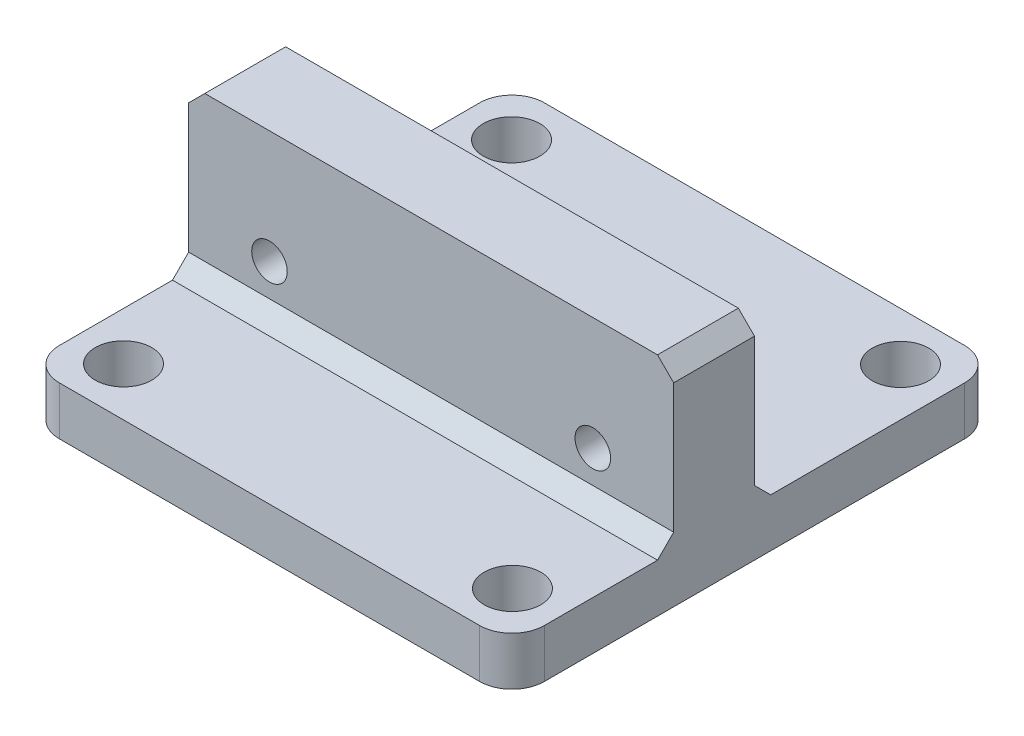
ISO-10303-21;
HEADER;
FILE_DESCRIPTION(('STEP AP214'),'2;1');
FILE_NAME('part.step','',(''),(''),'','','');
FILE_SCHEMA(('AUTOMOTIVE_DESIGN { 1 0 10303 214 1 1 1 1 }'));
ENDSEC;
DATA;
#1=APPLICATION_CONTEXT('core data for automotive mechanical design processes');
#2=APPLICATION_PROTOCOL_DEFINITION('international standard','automotive_design',2000,#1);
#3=PRODUCT_CONTEXT('',#1,'mechanical');
#4=PRODUCT('Part','Part','',(#3));
#5=PRODUCT_RELATED_PRODUCT_CATEGORY('part','',(#4));
#6=PRODUCT_DEFINITION_FORMATION('','',#4);
#7=PRODUCT_DEFINITION_CONTEXT('part definition',#1,'design');
#8=PRODUCT_DEFINITION('design','',#6,#7);
#9=PRODUCT_DEFINITION_SHAPE('','',#8);
#10=(LENGTH_UNIT() NAMED_UNIT(*) SI_UNIT(.MILLI.,.METRE.));
#11=(NAMED_UNIT(*) PLANE_ANGLE_UNIT() SI_UNIT($,.RADIAN.));
#12=(NAMED_UNIT(*) SI_UNIT($,.STERADIAN.) SOLID_ANGLE_UNIT());
#13=UNCERTAINTY_MEASURE_WITH_UNIT(LENGTH_MEASURE(1.E-05),#10,'distance_accuracy_value','');
#14=(GEOMETRIC_REPRESENTATION_CONTEXT(3) GLOBAL_UNCERTAINTY_ASSIGNED_CONTEXT((#13)) GLOBAL_UNIT_ASSIGNED_CONTEXT((#10,
#11,#12)) REPRESENTATION_CONTEXT('',''));
#15=CARTESIAN_POINT('',(0.,0.,0.));
#16=DIRECTION('',(0.,0.,1.));
#17=DIRECTION('',(1.,0.,0.));
#18=AXIS2_PLACEMENT_3D('',#15,#16,#17);
#19=CARTESIAN_POINT('',(15.,0.,-15.));
#20=DIRECTION('',(0.,0.,1.));
#21=DIRECTION('',(0.,-1.,0.));
#22=AXIS2_PLACEMENT_3D('',#19,#20,#21);
#23=PLANE('',#22);
#24=DIRECTION('',(-1.,0.,0.));
#25=VECTOR('',#24,1.);
#26=CARTESIAN_POINT('',(15.,0.,-15.));
#27=LINE('',#26,#25);
#28=CARTESIAN_POINT('',(13.,0.,-15.));
#29=VERTEX_POINT('',#28);
#30=CARTESIAN_POINT('',(-13.,0.,-15.));
#31=VERTEX_POINT('',#30);
#32=EDGE_CURVE('E177',#29,#31,#27,.T.);
#33=ORIENTED_EDGE('',*,*,#32,.T.);
#34=DIRECTION('',(0.,1.,0.));
#35=VECTOR('',#34,1.);
#36=CARTESIAN_POINT('',(-13.,0.,-15.));
#37=LINE('',#36,#35);
#38=CARTESIAN_POINT('',(-13.,3.,-15.));
#39=VERTEX_POINT('',#38);
#40=EDGE_CURVE('E210',#31,#39,#37,.T.);
#41=ORIENTED_EDGE('',*,*,#40,.T.);
#42=DIRECTION('',(-1.,0.,0.));
#43=VECTOR('',#42,1.);
#44=CARTESIAN_POINT('',(15.,3.,-15.));
#45=LINE('',#44,#43);
#46=CARTESIAN_POINT('',(13.,3.,-15.));
#47=VERTEX_POINT('',#46);
#48=EDGE_CURVE('E183',#47,#39,#45,.T.);
#49=ORIENTED_EDGE('',*,*,#48,.F.);
#50=DIRECTION('',(0.,1.,0.));
#51=VECTOR('',#50,1.);
#52=CARTESIAN_POINT('',(13.,0.,-15.));
#53=LINE('',#52,#51);
#54=EDGE_CURVE('E208',#47,#29,#53,.F.);
#55=ORIENTED_EDGE('',*,*,#54,.T.);
#56=EDGE_LOOP('',(#33,#41,#49,#55));
#57=FACE_BOUND('',#56,.T.);
#58=ADVANCED_FACE('F37',(#57),#23,.F.);
#59=CARTESIAN_POINT('',(15.,3.,-15.));
#60=DIRECTION('',(0.,-1.,0.));
#61=DIRECTION('',(0.,0.,-1.));
#62=AXIS2_PLACEMENT_3D('',#59,#60,#61);
#63=PLANE('',#62);
#64=CARTESIAN_POINT('',(-12.0294849703236,3.,-12.));
#65=DIRECTION('',(0.,1.,0.));
#66=DIRECTION('',(0.,0.,1.));
#67=AXIS2_PLACEMENT_3D('',#64,#65,#66);
#68=CIRCLE('',#67,1.75);
#69=CARTESIAN_POINT('',(-12.0294849703236,3.,-10.25));
#70=VERTEX_POINT('',#69);
#71=EDGE_CURVE('E578',#70,#70,#68,.T.);
#72=ORIENTED_EDGE('',*,*,#71,.F.);
#73=EDGE_LOOP('',(#72));
#74=FACE_BOUND('',#73,.T.);
#75=CARTESIAN_POINT('',(12.0294849703236,3.,-12.));
#76=DIRECTION('',(0.,1.,0.));
#77=DIRECTION('',(0.,0.,1.));
#78=AXIS2_PLACEMENT_3D('',#75,#76,#77);
#79=CIRCLE('',#78,1.75);
#80=CARTESIAN_POINT('',(12.0294849703236,3.,-10.25));
#81=VERTEX_POINT('',#80);
#82=EDGE_CURVE('E570',#81,#81,#79,.T.);
#83=ORIENTED_EDGE('',*,*,#82,.F.);
#84=EDGE_LOOP('',(#83));
#85=FACE_BOUND('',#84,.T.);
#86=DIRECTION('',(0.,0.,1.));
#87=VECTOR('',#86,1.);
#88=CARTESIAN_POINT('',(-15.,3.,-15.));
#89=LINE('',#88,#87);
#90=CARTESIAN_POINT('',(-15.,3.,-13.));
#91=VERTEX_POINT('',#90);
#92=CARTESIAN_POINT('',(-15.,3.,-0.999999999999999));
#93=VERTEX_POINT('',#92);
#94=EDGE_CURVE('E275',#91,#93,#89,.T.);
#95=ORIENTED_EDGE('',*,*,#94,.T.);
#96=DIRECTION('',(1.,0.,0.));
#97=VECTOR('',#96,1.);
#98=CARTESIAN_POINT('',(15.,3.,-0.999999999999999));
#99=LINE('',#98,#97);
#100=CARTESIAN_POINT('',(15.,3.,-0.999999999999999));
#101=VERTEX_POINT('',#100);
#102=EDGE_CURVE('E225',#93,#101,#99,.T.);
#103=ORIENTED_EDGE('',*,*,#102,.T.);
#104=DIRECTION('',(0.,0.,1.));
#105=VECTOR('',#104,1.);
#106=CARTESIAN_POINT('',(15.,3.,-15.));
#107=LINE('',#106,#105);
#108=CARTESIAN_POINT('',(15.,3.,-13.));
#109=VERTEX_POINT('',#108);
#110=EDGE_CURVE('E281',#109,#101,#107,.T.);
#111=ORIENTED_EDGE('',*,*,#110,.F.);
#112=CARTESIAN_POINT('',(13.,3.,-13.));
#113=DIRECTION('',(0.,-1.,0.));
#114=DIRECTION('',(0.,0.,-1.));
#115=AXIS2_PLACEMENT_3D('',#112,#113,#114);
#116=CIRCLE('',#115,2.);
#117=EDGE_CURVE('E213',#109,#47,#116,.F.);
#118=ORIENTED_EDGE('',*,*,#117,.T.);
#119=ORIENTED_EDGE('',*,*,#48,.T.);
#120=CARTESIAN_POINT('',(-13.,3.,-13.));
#121=DIRECTION('',(0.,-1.,0.));
#122=DIRECTION('',(0.,0.,-1.));
#123=AXIS2_PLACEMENT_3D('',#120,#121,#122);
#124=CIRCLE('',#123,2.);
#125=EDGE_CURVE('E215',#39,#91,#124,.F.);
#126=ORIENTED_EDGE('',*,*,#125,.T.);
#127=EDGE_LOOP('',(#95,#103,#111,#118,#119,#126));
#128=FACE_BOUND('',#127,.T.);
#129=ADVANCED_FACE('F351',(#74,#85,#128),#63,.F.);
#130=CARTESIAN_POINT('',(15.,3.,0.));
#131=DIRECTION('',(0.,0.,1.));
#132=DIRECTION('',(0.,-1.,0.));
#133=AXIS2_PLACEMENT_3D('',#130,#131,#132);
#134=PLANE('',#133);
#135=CARTESIAN_POINT('',(10.,6.,0.));
#136=DIRECTION('',(0.,0.,-1.));
#137=DIRECTION('',(0.,1.,0.));
#138=AXIS2_PLACEMENT_3D('',#135,#136,#137);
#139=CIRCLE('',#138,1.1);
#140=CARTESIAN_POINT('',(10.,7.1,0.));
#141=VERTEX_POINT('',#140);
#142=EDGE_CURVE('E222',#141,#141,#139,.T.);
#143=ORIENTED_EDGE('',*,*,#142,.F.);
#144=EDGE_LOOP('',(#143));
#145=FACE_BOUND('',#144,.T.);
#146=CARTESIAN_POINT('',(-10.,6.,0.));
#147=DIRECTION('',(0.,0.,-1.));
#148=DIRECTION('',(0.,1.,0.));
#149=AXIS2_PLACEMENT_3D('',#146,#147,#148);
#150=CIRCLE('',#149,1.1);
#151=CARTESIAN_POINT('',(-10.,7.1,0.));
#152=VERTEX_POINT('',#151);
#153=EDGE_CURVE('E221',#152,#152,#150,.T.);
#154=ORIENTED_EDGE('',*,*,#153,.F.);
#155=EDGE_LOOP('',(#154));
#156=FACE_BOUND('',#155,.T.);
#157=DIRECTION('',(0.,1.,0.));
#158=VECTOR('',#157,1.);
#159=CARTESIAN_POINT('',(-15.,3.,0.));
#160=LINE('',#159,#158);
#161=CARTESIAN_POINT('',(-15.,4.00000000000001,0.));
#162=VERTEX_POINT('',#161);
#163=CARTESIAN_POINT('',(-15.,12.,0.));
#164=VERTEX_POINT('',#163);
#165=EDGE_CURVE('E255',#162,#164,#160,.T.);
#166=ORIENTED_EDGE('',*,*,#165,.T.);
#167=DIRECTION('',(-0.707106781186545,-0.70710678118655,0.));
#168=VECTOR('',#167,1.);
#169=CARTESIAN_POINT('',(-14.,13.,0.));
#170=LINE('',#169,#168);
#171=CARTESIAN_POINT('',(-14.,13.,0.));
#172=VERTEX_POINT('',#171);
#173=EDGE_CURVE('E46',#164,#172,#170,.F.);
#174=ORIENTED_EDGE('',*,*,#173,.T.);
#175=DIRECTION('',(-1.,0.,0.));
#176=VECTOR('',#175,1.);
#177=CARTESIAN_POINT('',(15.,13.,0.));
#178=LINE('',#177,#176);
#179=CARTESIAN_POINT('',(14.,13.,0.));
#180=VERTEX_POINT('',#179);
#181=EDGE_CURVE('E188',#180,#172,#178,.T.);
#182=ORIENTED_EDGE('',*,*,#181,.F.);
#183=DIRECTION('',(0.707106781186548,-0.707106781186548,0.));
#184=VECTOR('',#183,1.);
#185=CARTESIAN_POINT('',(15.,12.,0.));
#186=LINE('',#185,#184);
#187=CARTESIAN_POINT('',(15.,12.,0.));
#188=VERTEX_POINT('',#187);
#189=EDGE_CURVE('E53',#180,#188,#186,.T.);
#190=ORIENTED_EDGE('',*,*,#189,.T.);
#191=DIRECTION('',(0.,1.,0.));
#192=VECTOR('',#191,1.);
#193=CARTESIAN_POINT('',(15.,3.,0.));
#194=LINE('',#193,#192);
#195=CARTESIAN_POINT('',(15.,4.00000000000001,0.));
#196=VERTEX_POINT('',#195);
#197=EDGE_CURVE('E329',#196,#188,#194,.T.);
#198=ORIENTED_EDGE('',*,*,#197,.F.);
#199=DIRECTION('',(-1.,0.,0.));
#200=VECTOR('',#199,1.);
#201=CARTESIAN_POINT('',(-15.,4.00000000000001,0.));
#202=LINE('',#201,#200);
#203=EDGE_CURVE('E217',#196,#162,#202,.T.);
#204=ORIENTED_EDGE('',*,*,#203,.T.);
#205=EDGE_LOOP('',(#166,#174,#182,#190,#198,#204));
#206=FACE_BOUND('',#205,.T.);
#207=ADVANCED_FACE('F254',(#145,#156,#206),#134,.F.);
#208=CARTESIAN_POINT('',(15.,13.,0.));
#209=DIRECTION('',(0.,-1.,0.));
#210=DIRECTION('',(0.,0.,-1.));
#211=AXIS2_PLACEMENT_3D('',#208,#209,#210);
#212=PLANE('',#211);
#213=ORIENTED_EDGE('',*,*,#181,.T.);
#214=DIRECTION('',(0.,0.,1.));
#215=VECTOR('',#214,1.);
#216=CARTESIAN_POINT('',(-14.,13.,0.));
#217=LINE('',#216,#215);
#218=CARTESIAN_POINT('',(-14.,13.,5.));
#219=VERTEX_POINT('',#218);
#220=EDGE_CURVE('E244',#172,#219,#217,.T.);
#221=ORIENTED_EDGE('',*,*,#220,.T.);
#222=DIRECTION('',(-1.,0.,0.));
#223=VECTOR('',#222,1.);
#224=CARTESIAN_POINT('',(15.,13.,5.));
#225=LINE('',#224,#223);
#226=CARTESIAN_POINT('',(14.,13.,5.));
#227=VERTEX_POINT('',#226);
#228=EDGE_CURVE('E263',#227,#219,#225,.T.);
#229=ORIENTED_EDGE('',*,*,#228,.F.);
#230=DIRECTION('',(0.,0.,-1.));
#231=VECTOR('',#230,1.);
#232=CARTESIAN_POINT('',(14.,13.,0.));
#233=LINE('',#232,#231);
#234=EDGE_CURVE('E242',#227,#180,#233,.T.);
#235=ORIENTED_EDGE('',*,*,#234,.T.);
#236=EDGE_LOOP('',(#213,#221,#229,#235));
#237=FACE_BOUND('',#236,.T.);
#238=ADVANCED_FACE('F259',(#237),#212,.F.);
#239=CARTESIAN_POINT('',(15.,13.,5.));
#240=DIRECTION('',(0.,0.,-1.));
#241=DIRECTION('',(-1.,0.,0.));
#242=AXIS2_PLACEMENT_3D('',#239,#240,#241);
#243=PLANE('',#242);
#244=CARTESIAN_POINT('',(10.,6.,5.));
#245=DIRECTION('',(0.,0.,-1.));
#246=DIRECTION('',(-1.,0.,0.));
#247=AXIS2_PLACEMENT_3D('',#244,#245,#246);
#248=CIRCLE('',#247,1.1);
#249=CARTESIAN_POINT('',(8.9,6.,5.));
#250=VERTEX_POINT('',#249);
#251=EDGE_CURVE('E218',#250,#250,#248,.T.);
#252=ORIENTED_EDGE('',*,*,#251,.T.);
#253=EDGE_LOOP('',(#252));
#254=FACE_BOUND('',#253,.T.);
#255=CARTESIAN_POINT('',(-10.,6.00000000000001,5.));
#256=DIRECTION('',(0.,0.,-1.));
#257=DIRECTION('',(-1.,0.,0.));
#258=AXIS2_PLACEMENT_3D('',#255,#256,#257);
#259=CIRCLE('',#258,1.1);
#260=CARTESIAN_POINT('',(-11.1,6.00000000000001,5.));
#261=VERTEX_POINT('',#260);
#262=EDGE_CURVE('E581',#261,#261,#259,.T.);
#263=ORIENTED_EDGE('',*,*,#262,.T.);
#264=EDGE_LOOP('',(#263));
#265=FACE_BOUND('',#264,.T.);
#266=ORIENTED_EDGE('',*,*,#228,.T.);
#267=DIRECTION('',(0.707106781186545,0.70710678118655,0.));
#268=VECTOR('',#267,1.);
#269=CARTESIAN_POINT('',(-14.,13.,5.));
#270=LINE('',#269,#268);
#271=CARTESIAN_POINT('',(-15.,12.,5.));
#272=VERTEX_POINT('',#271);
#273=EDGE_CURVE('E249',#219,#272,#270,.F.);
#274=ORIENTED_EDGE('',*,*,#273,.T.);
#275=DIRECTION('',(0.,-1.,0.));
#276=VECTOR('',#275,1.);
#277=CARTESIAN_POINT('',(-15.,13.,5.));
#278=LINE('',#277,#276);
#279=CARTESIAN_POINT('',(-15.,4.00000000000001,5.));
#280=VERTEX_POINT('',#279);
#281=EDGE_CURVE('E267',#272,#280,#278,.T.);
#282=ORIENTED_EDGE('',*,*,#281,.T.);
#283=DIRECTION('',(1.,0.,0.));
#284=VECTOR('',#283,1.);
#285=CARTESIAN_POINT('',(15.,4.00000000000001,5.));
#286=LINE('',#285,#284);
#287=CARTESIAN_POINT('',(15.,4.00000000000001,5.));
#288=VERTEX_POINT('',#287);
#289=EDGE_CURVE('E230',#280,#288,#286,.T.);
#290=ORIENTED_EDGE('',*,*,#289,.T.);
#291=DIRECTION('',(0.,-1.,0.));
#292=VECTOR('',#291,1.);
#293=CARTESIAN_POINT('',(15.,13.,5.));
#294=LINE('',#293,#292);
#295=CARTESIAN_POINT('',(15.,12.,5.));
#296=VERTEX_POINT('',#295);
#297=EDGE_CURVE('E312',#296,#288,#294,.T.);
#298=ORIENTED_EDGE('',*,*,#297,.F.);
#299=DIRECTION('',(-0.707106781186548,0.707106781186548,0.));
#300=VECTOR('',#299,1.);
#301=CARTESIAN_POINT('',(15.,12.,5.));
#302=LINE('',#301,#300);
#303=EDGE_CURVE('E247',#296,#227,#302,.T.);
#304=ORIENTED_EDGE('',*,*,#303,.T.);
#305=EDGE_LOOP('',(#266,#274,#282,#290,#298,#304));
#306=FACE_BOUND('',#305,.T.);
#307=ADVANCED_FACE('F266',(#254,#265,#306),#243,.F.);
#308=CARTESIAN_POINT('',(15.,3.,5.));
#309=DIRECTION('',(0.,-1.,0.));
#310=DIRECTION('',(0.,0.,-1.));
#311=AXIS2_PLACEMENT_3D('',#308,#309,#310);
#312=PLANE('',#311);
#313=CARTESIAN_POINT('',(-12.0294849703236,3.,12.));
#314=DIRECTION('',(0.,1.,0.));
#315=DIRECTION('',(0.,0.,1.));
#316=AXIS2_PLACEMENT_3D('',#313,#314,#315);
#317=CIRCLE('',#316,1.75);
#318=CARTESIAN_POINT('',(-12.0294849703236,3.,13.75));
#319=VERTEX_POINT('',#318);
#320=EDGE_CURVE('E566',#319,#319,#317,.T.);
#321=ORIENTED_EDGE('',*,*,#320,.F.);
#322=EDGE_LOOP('',(#321));
#323=FACE_BOUND('',#322,.T.);
#324=CARTESIAN_POINT('',(12.0294849703236,3.,12.));
#325=DIRECTION('',(0.,1.,0.));
#326=DIRECTION('',(0.,0.,1.));
#327=AXIS2_PLACEMENT_3D('',#324,#325,#326);
#328=CIRCLE('',#327,1.75);
#329=CARTESIAN_POINT('',(12.0294849703236,3.,13.75));
#330=VERTEX_POINT('',#329);
#331=EDGE_CURVE('E319',#330,#330,#328,.T.);
#332=ORIENTED_EDGE('',*,*,#331,.F.);
#333=EDGE_LOOP('',(#332));
#334=FACE_BOUND('',#333,.T.);
#335=DIRECTION('',(0.,0.,1.));
#336=VECTOR('',#335,1.);
#337=CARTESIAN_POINT('',(15.,3.,5.));
#338=LINE('',#337,#336);
#339=CARTESIAN_POINT('',(15.,3.,6.00000000000002));
#340=VERTEX_POINT('',#339);
#341=CARTESIAN_POINT('',(15.,3.,13.));
#342=VERTEX_POINT('',#341);
#343=EDGE_CURVE('E310',#340,#342,#338,.T.);
#344=ORIENTED_EDGE('',*,*,#343,.F.);
#345=DIRECTION('',(-1.,0.,0.));
#346=VECTOR('',#345,1.);
#347=CARTESIAN_POINT('',(-15.,3.,6.00000000000002));
#348=LINE('',#347,#346);
#349=CARTESIAN_POINT('',(-15.,3.,6.00000000000002));
#350=VERTEX_POINT('',#349);
#351=EDGE_CURVE('E227',#340,#350,#348,.T.);
#352=ORIENTED_EDGE('',*,*,#351,.T.);
#353=DIRECTION('',(0.,0.,1.));
#354=VECTOR('',#353,1.);
#355=CARTESIAN_POINT('',(-15.,3.,5.));
#356=LINE('',#355,#354);
#357=CARTESIAN_POINT('',(-15.,3.,13.));
#358=VERTEX_POINT('',#357);
#359=EDGE_CURVE('E271',#350,#358,#356,.T.);
#360=ORIENTED_EDGE('',*,*,#359,.T.);
#361=CARTESIAN_POINT('',(-13.,3.,13.));
#362=DIRECTION('',(0.,-1.,0.));
#363=DIRECTION('',(0.,0.,-1.));
#364=AXIS2_PLACEMENT_3D('',#361,#362,#363);
#365=CIRCLE('',#364,2.);
#366=CARTESIAN_POINT('',(-13.,3.,15.));
#367=VERTEX_POINT('',#366);
#368=EDGE_CURVE('E201',#358,#367,#365,.F.);
#369=ORIENTED_EDGE('',*,*,#368,.T.);
#370=DIRECTION('',(-1.,0.,0.));
#371=VECTOR('',#370,1.);
#372=CARTESIAN_POINT('',(15.,3.,15.));
#373=LINE('',#372,#371);
#374=CARTESIAN_POINT('',(13.,3.,15.));
#375=VERTEX_POINT('',#374);
#376=EDGE_CURVE('E176',#375,#367,#373,.T.);
#377=ORIENTED_EDGE('',*,*,#376,.F.);
#378=CARTESIAN_POINT('',(13.,3.,13.));
#379=DIRECTION('',(0.,-1.,0.));
#380=DIRECTION('',(0.,0.,-1.));
#381=AXIS2_PLACEMENT_3D('',#378,#379,#380);
#382=CIRCLE('',#381,2.);
#383=EDGE_CURVE('E182',#375,#342,#382,.F.);
#384=ORIENTED_EDGE('',*,*,#383,.T.);
#385=EDGE_LOOP('',(#344,#352,#360,#369,#377,#384));
#386=FACE_BOUND('',#385,.T.);
#387=ADVANCED_FACE('F337',(#323,#334,#386),#312,.F.);
#388=CARTESIAN_POINT('',(15.,3.,15.));
#389=DIRECTION('',(0.,0.,-1.));
#390=DIRECTION('',(0.,1.,0.));
#391=AXIS2_PLACEMENT_3D('',#388,#389,#390);
#392=PLANE('',#391);
#393=ORIENTED_EDGE('',*,*,#376,.T.);
#394=DIRECTION('',(0.,-1.,0.));
#395=VECTOR('',#394,1.);
#396=CARTESIAN_POINT('',(-13.,3.,15.));
#397=LINE('',#396,#395);
#398=CARTESIAN_POINT('',(-13.,0.,15.));
#399=VERTEX_POINT('',#398);
#400=EDGE_CURVE('E175',#367,#399,#397,.T.);
#401=ORIENTED_EDGE('',*,*,#400,.T.);
#402=DIRECTION('',(-1.,0.,0.));
#403=VECTOR('',#402,1.);
#404=CARTESIAN_POINT('',(15.,0.,15.));
#405=LINE('',#404,#403);
#406=CARTESIAN_POINT('',(13.,0.,15.));
#407=VERTEX_POINT('',#406);
#408=EDGE_CURVE('E158',#407,#399,#405,.T.);
#409=ORIENTED_EDGE('',*,*,#408,.F.);
#410=DIRECTION('',(0.,-1.,0.));
#411=VECTOR('',#410,1.);
#412=CARTESIAN_POINT('',(13.,3.,15.));
#413=LINE('',#412,#411);
#414=EDGE_CURVE('E172',#407,#375,#413,.F.);
#415=ORIENTED_EDGE('',*,*,#414,.T.);
#416=EDGE_LOOP('',(#393,#401,#409,#415));
#417=FACE_BOUND('',#416,.T.);
#418=ADVANCED_FACE('F171',(#417),#392,.F.);
#419=CARTESIAN_POINT('',(15.,0.,15.));
#420=DIRECTION('',(0.,1.,0.));
#421=DIRECTION('',(0.,0.,1.));
#422=AXIS2_PLACEMENT_3D('',#419,#420,#421);
#423=PLANE('',#422);
#424=CARTESIAN_POINT('',(-12.0294849703236,0.,-12.));
#425=DIRECTION('',(0.,1.,0.));
#426=DIRECTION('',(0.,0.,1.));
#427=AXIS2_PLACEMENT_3D('',#424,#425,#426);
#428=CIRCLE('',#427,1.75);
#429=CARTESIAN_POINT('',(-12.0294849703236,0.,-10.25));
#430=VERTEX_POINT('',#429);
#431=EDGE_CURVE('E575',#430,#430,#428,.T.);
#432=ORIENTED_EDGE('',*,*,#431,.T.);
#433=EDGE_LOOP('',(#432));
#434=FACE_BOUND('',#433,.T.);
#435=CARTESIAN_POINT('',(12.0294849703236,0.,-12.));
#436=DIRECTION('',(0.,1.,0.));
#437=DIRECTION('',(0.,0.,1.));
#438=AXIS2_PLACEMENT_3D('',#435,#436,#437);
#439=CIRCLE('',#438,1.75);
#440=CARTESIAN_POINT('',(12.0294849703236,0.,-10.25));
#441=VERTEX_POINT('',#440);
#442=EDGE_CURVE('E567',#441,#441,#439,.T.);
#443=ORIENTED_EDGE('',*,*,#442,.T.);
#444=EDGE_LOOP('',(#443));
#445=FACE_BOUND('',#444,.T.);
#446=CARTESIAN_POINT('',(-12.0294849703236,0.,12.));
#447=DIRECTION('',(0.,1.,0.));
#448=DIRECTION('',(0.,0.,1.));
#449=AXIS2_PLACEMENT_3D('',#446,#447,#448);
#450=CIRCLE('',#449,1.75);
#451=CARTESIAN_POINT('',(-12.0294849703236,0.,13.75));
#452=VERTEX_POINT('',#451);
#453=EDGE_CURVE('E324',#452,#452,#450,.T.);
#454=ORIENTED_EDGE('',*,*,#453,.T.);
#455=EDGE_LOOP('',(#454));
#456=FACE_BOUND('',#455,.T.);
#457=CARTESIAN_POINT('',(12.0294849703236,0.,12.));
#458=DIRECTION('',(0.,1.,0.));
#459=DIRECTION('',(0.,0.,1.));
#460=AXIS2_PLACEMENT_3D('',#457,#458,#459);
#461=CIRCLE('',#460,1.75);
#462=CARTESIAN_POINT('',(12.0294849703236,0.,13.75));
#463=VERTEX_POINT('',#462);
#464=EDGE_CURVE('E315',#463,#463,#461,.T.);
#465=ORIENTED_EDGE('',*,*,#464,.T.);
#466=EDGE_LOOP('',(#465));
#467=FACE_BOUND('',#466,.T.);
#468=ORIENTED_EDGE('',*,*,#408,.T.);
#469=CARTESIAN_POINT('',(-13.,0.,13.));
#470=DIRECTION('',(0.,1.,0.));
#471=DIRECTION('',(0.,0.,1.));
#472=AXIS2_PLACEMENT_3D('',#469,#470,#471);
#473=CIRCLE('',#472,2.);
#474=CARTESIAN_POINT('',(-15.,0.,13.));
#475=VERTEX_POINT('',#474);
#476=EDGE_CURVE('E165',#399,#475,#473,.F.);
#477=ORIENTED_EDGE('',*,*,#476,.T.);
#478=DIRECTION('',(0.,0.,-1.));
#479=VECTOR('',#478,1.);
#480=CARTESIAN_POINT('',(-15.,0.,15.));
#481=LINE('',#480,#479);
#482=CARTESIAN_POINT('',(-15.,0.,-13.));
#483=VERTEX_POINT('',#482);
#484=EDGE_CURVE('E273',#475,#483,#481,.T.);
#485=ORIENTED_EDGE('',*,*,#484,.T.);
#486=CARTESIAN_POINT('',(-13.,0.,-13.));
#487=DIRECTION('',(0.,1.,0.));
#488=DIRECTION('',(0.,0.,1.));
#489=AXIS2_PLACEMENT_3D('',#486,#487,#488);
#490=CIRCLE('',#489,2.);
#491=EDGE_CURVE('E166',#483,#31,#490,.F.);
#492=ORIENTED_EDGE('',*,*,#491,.T.);
#493=ORIENTED_EDGE('',*,*,#32,.F.);
#494=CARTESIAN_POINT('',(13.,0.,-13.));
#495=DIRECTION('',(0.,1.,0.));
#496=DIRECTION('',(0.,0.,1.));
#497=AXIS2_PLACEMENT_3D('',#494,#495,#496);
#498=CIRCLE('',#497,2.);
#499=CARTESIAN_POINT('',(15.,0.,-13.));
#500=VERTEX_POINT('',#499);
#501=EDGE_CURVE('E185',#29,#500,#498,.F.);
#502=ORIENTED_EDGE('',*,*,#501,.T.);
#503=DIRECTION('',(0.,0.,-1.));
#504=VECTOR('',#503,1.);
#505=CARTESIAN_POINT('',(15.,0.,15.));
#506=LINE('',#505,#504);
#507=CARTESIAN_POINT('',(15.,0.,13.));
#508=VERTEX_POINT('',#507);
#509=EDGE_CURVE('E160',#508,#500,#506,.T.);
#510=ORIENTED_EDGE('',*,*,#509,.F.);
#511=CARTESIAN_POINT('',(13.,0.,13.));
#512=DIRECTION('',(0.,1.,0.));
#513=DIRECTION('',(0.,0.,1.));
#514=AXIS2_PLACEMENT_3D('',#511,#512,#513);
#515=CIRCLE('',#514,2.);
#516=EDGE_CURVE('E155',#508,#407,#515,.F.);
#517=ORIENTED_EDGE('',*,*,#516,.T.);
#518=EDGE_LOOP('',(#468,#477,#485,#492,#493,#502,#510,#517));
#519=FACE_BOUND('',#518,.T.);
#520=ADVANCED_FACE('F157',(#434,#445,#456,#467,#519),#423,.F.);
#521=CARTESIAN_POINT('',(15.,0.,0.));
#522=DIRECTION('',(1.,0.,0.));
#523=DIRECTION('',(0.,0.,-1.));
#524=AXIS2_PLACEMENT_3D('',#521,#522,#523);
#525=PLANE('',#524);
#526=ORIENTED_EDGE('',*,*,#197,.T.);
#527=DIRECTION('',(0.,0.,1.));
#528=VECTOR('',#527,1.);
#529=CARTESIAN_POINT('',(15.,12.,5.));
#530=LINE('',#529,#528);
#531=EDGE_CURVE('E11',#188,#296,#530,.T.);
#532=ORIENTED_EDGE('',*,*,#531,.T.);
#533=ORIENTED_EDGE('',*,*,#297,.T.);
#534=DIRECTION('',(0.,0.707106781186545,-0.70710678118655));
#535=VECTOR('',#534,1.);
#536=CARTESIAN_POINT('',(15.,3.,6.00000000000002));
#537=LINE('',#536,#535);
#538=EDGE_CURVE('E240',#288,#340,#537,.F.);
#539=ORIENTED_EDGE('',*,*,#538,.T.);
#540=ORIENTED_EDGE('',*,*,#343,.T.);
#541=DIRECTION('',(0.,-1.,0.));
#542=VECTOR('',#541,1.);
#543=CARTESIAN_POINT('',(15.,0.,13.));
#544=LINE('',#543,#542);
#545=EDGE_CURVE('E206',#342,#508,#544,.T.);
#546=ORIENTED_EDGE('',*,*,#545,.T.);
#547=ORIENTED_EDGE('',*,*,#509,.T.);
#548=DIRECTION('',(0.,1.,0.));
#549=VECTOR('',#548,1.);
#550=CARTESIAN_POINT('',(15.,3.,-13.));
#551=LINE('',#550,#549);
#552=EDGE_CURVE('E203',#500,#109,#551,.T.);
#553=ORIENTED_EDGE('',*,*,#552,.T.);
#554=ORIENTED_EDGE('',*,*,#110,.T.);
#555=DIRECTION('',(0.,-0.707106781186552,-0.707106781186543));
#556=VECTOR('',#555,1.);
#557=CARTESIAN_POINT('',(15.,4.00000000000001,0.));
#558=LINE('',#557,#556);
#559=EDGE_CURVE('E235',#101,#196,#558,.F.);
#560=ORIENTED_EDGE('',*,*,#559,.T.);
#561=EDGE_LOOP('',(#526,#532,#533,#539,#540,#546,#547,#553,#554,#560));
#562=FACE_BOUND('',#561,.T.);
#563=ADVANCED_FACE('F307',(#562),#525,.T.);
#564=CARTESIAN_POINT('',(-15.,0.,0.));
#565=DIRECTION('',(1.,0.,0.));
#566=DIRECTION('',(0.,0.,-1.));
#567=AXIS2_PLACEMENT_3D('',#564,#565,#566);
#568=PLANE('',#567);
#569=ORIENTED_EDGE('',*,*,#281,.F.);
#570=DIRECTION('',(0.,0.,-1.));
#571=VECTOR('',#570,1.);
#572=CARTESIAN_POINT('',(-15.,12.,0.));
#573=LINE('',#572,#571);
#574=EDGE_CURVE('E61',#272,#164,#573,.T.);
#575=ORIENTED_EDGE('',*,*,#574,.T.);
#576=ORIENTED_EDGE('',*,*,#165,.F.);
#577=DIRECTION('',(0.,0.707106781186552,0.707106781186543));
#578=VECTOR('',#577,1.);
#579=CARTESIAN_POINT('',(-15.,1.99999999999998,-2.00000000000001));
#580=LINE('',#579,#578);
#581=EDGE_CURVE('E233',#162,#93,#580,.F.);
#582=ORIENTED_EDGE('',*,*,#581,.T.);
#583=ORIENTED_EDGE('',*,*,#94,.F.);
#584=DIRECTION('',(0.,1.,0.));
#585=VECTOR('',#584,1.);
#586=CARTESIAN_POINT('',(-15.,0.,-13.));
#587=LINE('',#586,#585);
#588=EDGE_CURVE('E195',#91,#483,#587,.F.);
#589=ORIENTED_EDGE('',*,*,#588,.T.);
#590=ORIENTED_EDGE('',*,*,#484,.F.);
#591=DIRECTION('',(0.,-1.,0.));
#592=VECTOR('',#591,1.);
#593=CARTESIAN_POINT('',(-15.,0.,13.));
#594=LINE('',#593,#592);
#595=EDGE_CURVE('E197',#475,#358,#594,.F.);
#596=ORIENTED_EDGE('',*,*,#595,.T.);
#597=ORIENTED_EDGE('',*,*,#359,.F.);
#598=DIRECTION('',(0.,-0.707106781186545,0.70710678118655));
#599=VECTOR('',#598,1.);
#600=CARTESIAN_POINT('',(-15.,4.50000000000002,4.49999999999999));
#601=LINE('',#600,#599);
#602=EDGE_CURVE('E237',#350,#280,#601,.F.);
#603=ORIENTED_EDGE('',*,*,#602,.T.);
#604=EDGE_LOOP('',(#569,#575,#576,#582,#583,#589,#590,#596,#597,#603));
#605=FACE_BOUND('',#604,.T.);
#606=ADVANCED_FACE('F268',(#605),#568,.F.);
#607=CARTESIAN_POINT('',(12.0294849703236,3.,12.));
#608=DIRECTION('',(0.,1.,0.));
#609=DIRECTION('',(0.,0.,1.));
#610=AXIS2_PLACEMENT_3D('',#607,#608,#609);
#611=CYLINDRICAL_SURFACE('',#610,1.75);
#612=ORIENTED_EDGE('',*,*,#464,.F.);
#613=EDGE_LOOP('',(#612));
#614=FACE_BOUND('',#613,.T.);
#615=ORIENTED_EDGE('',*,*,#331,.T.);
#616=EDGE_LOOP('',(#615));
#617=FACE_BOUND('',#616,.T.);
#618=ADVANCED_FACE('F406',(#614,#617),#611,.F.);
#619=CARTESIAN_POINT('',(-12.0294849703236,3.,12.));
#620=DIRECTION('',(0.,1.,0.));
#621=DIRECTION('',(0.,0.,1.));
#622=AXIS2_PLACEMENT_3D('',#619,#620,#621);
#623=CYLINDRICAL_SURFACE('',#622,1.75);
#624=ORIENTED_EDGE('',*,*,#453,.F.);
#625=EDGE_LOOP('',(#624));
#626=FACE_BOUND('',#625,.T.);
#627=ORIENTED_EDGE('',*,*,#320,.T.);
#628=EDGE_LOOP('',(#627));
#629=FACE_BOUND('',#628,.T.);
#630=ADVANCED_FACE('F539',(#626,#629),#623,.F.);
#631=CARTESIAN_POINT('',(12.0294849703236,3.,-12.));
#632=DIRECTION('',(0.,1.,0.));
#633=DIRECTION('',(0.,0.,1.));
#634=AXIS2_PLACEMENT_3D('',#631,#632,#633);
#635=CYLINDRICAL_SURFACE('',#634,1.75);
#636=ORIENTED_EDGE('',*,*,#442,.F.);
#637=EDGE_LOOP('',(#636));
#638=FACE_BOUND('',#637,.T.);
#639=ORIENTED_EDGE('',*,*,#82,.T.);
#640=EDGE_LOOP('',(#639));
#641=FACE_BOUND('',#640,.T.);
#642=ADVANCED_FACE('F529',(#638,#641),#635,.F.);
#643=CARTESIAN_POINT('',(-12.0294849703236,3.,-12.));
#644=DIRECTION('',(0.,1.,0.));
#645=DIRECTION('',(0.,0.,1.));
#646=AXIS2_PLACEMENT_3D('',#643,#644,#645);
#647=CYLINDRICAL_SURFACE('',#646,1.75);
#648=ORIENTED_EDGE('',*,*,#431,.F.);
#649=EDGE_LOOP('',(#648));
#650=FACE_BOUND('',#649,.T.);
#651=ORIENTED_EDGE('',*,*,#71,.T.);
#652=EDGE_LOOP('',(#651));
#653=FACE_BOUND('',#652,.T.);
#654=ADVANCED_FACE('F362',(#650,#653),#647,.F.);
#655=CARTESIAN_POINT('',(-13.,3.,13.));
#656=DIRECTION('',(0.,-1.,0.));
#657=DIRECTION('',(0.,0.,-1.));
#658=AXIS2_PLACEMENT_3D('',#655,#656,#657);
#659=CYLINDRICAL_SURFACE('',#658,2.);
#660=ORIENTED_EDGE('',*,*,#368,.F.);
#661=ORIENTED_EDGE('',*,*,#595,.F.);
#662=ORIENTED_EDGE('',*,*,#476,.F.);
#663=ORIENTED_EDGE('',*,*,#400,.F.);
#664=EDGE_LOOP('',(#660,#661,#662,#663));
#665=FACE_BOUND('',#664,.T.);
#666=ADVANCED_FACE('F288',(#665),#659,.T.);
#667=CARTESIAN_POINT('',(13.,0.,13.));
#668=DIRECTION('',(0.,1.,0.));
#669=DIRECTION('',(0.,0.,1.));
#670=AXIS2_PLACEMENT_3D('',#667,#668,#669);
#671=CYLINDRICAL_SURFACE('',#670,2.);
#672=ORIENTED_EDGE('',*,*,#383,.F.);
#673=ORIENTED_EDGE('',*,*,#414,.F.);
#674=ORIENTED_EDGE('',*,*,#516,.F.);
#675=ORIENTED_EDGE('',*,*,#545,.F.);
#676=EDGE_LOOP('',(#672,#673,#674,#675));
#677=FACE_BOUND('',#676,.T.);
#678=ADVANCED_FACE('F180',(#677),#671,.T.);
#679=CARTESIAN_POINT('',(-13.,0.,-13.));
#680=DIRECTION('',(0.,1.,0.));
#681=DIRECTION('',(0.,0.,1.));
#682=AXIS2_PLACEMENT_3D('',#679,#680,#681);
#683=CYLINDRICAL_SURFACE('',#682,2.);
#684=ORIENTED_EDGE('',*,*,#491,.F.);
#685=ORIENTED_EDGE('',*,*,#588,.F.);
#686=ORIENTED_EDGE('',*,*,#125,.F.);
#687=ORIENTED_EDGE('',*,*,#40,.F.);
#688=EDGE_LOOP('',(#684,#685,#686,#687));
#689=FACE_BOUND('',#688,.T.);
#690=ADVANCED_FACE('F296',(#689),#683,.T.);
#691=CARTESIAN_POINT('',(13.,0.,-13.));
#692=DIRECTION('',(0.,-1.,0.));
#693=DIRECTION('',(0.,0.,-1.));
#694=AXIS2_PLACEMENT_3D('',#691,#692,#693);
#695=CYLINDRICAL_SURFACE('',#694,2.);
#696=ORIENTED_EDGE('',*,*,#501,.F.);
#697=ORIENTED_EDGE('',*,*,#54,.F.);
#698=ORIENTED_EDGE('',*,*,#117,.F.);
#699=ORIENTED_EDGE('',*,*,#552,.F.);
#700=EDGE_LOOP('',(#696,#697,#698,#699));
#701=FACE_BOUND('',#700,.T.);
#702=ADVANCED_FACE('F304',(#701),#695,.T.);
#703=CARTESIAN_POINT('',(-10.,6.,0.));
#704=DIRECTION('',(0.,0.,-1.));
#705=DIRECTION('',(0.,1.,0.));
#706=AXIS2_PLACEMENT_3D('',#703,#704,#705);
#707=CYLINDRICAL_SURFACE('',#706,1.1);
#708=ORIENTED_EDGE('',*,*,#153,.T.);
#709=EDGE_LOOP('',(#708));
#710=FACE_BOUND('',#709,.T.);
#711=ORIENTED_EDGE('',*,*,#262,.F.);
#712=EDGE_LOOP('',(#711));
#713=FACE_BOUND('',#712,.T.);
#714=ADVANCED_FACE('F369',(#710,#713),#707,.F.);
#715=CARTESIAN_POINT('',(10.,6.,0.));
#716=DIRECTION('',(0.,0.,-1.));
#717=DIRECTION('',(0.,1.,0.));
#718=AXIS2_PLACEMENT_3D('',#715,#716,#717);
#719=CYLINDRICAL_SURFACE('',#718,1.1);
#720=ORIENTED_EDGE('',*,*,#142,.T.);
#721=EDGE_LOOP('',(#720));
#722=FACE_BOUND('',#721,.T.);
#723=ORIENTED_EDGE('',*,*,#251,.F.);
#724=EDGE_LOOP('',(#723));
#725=FACE_BOUND('',#724,.T.);
#726=ADVANCED_FACE('F377',(#722,#725),#719,.F.);
#727=CARTESIAN_POINT('',(15.,4.00000000000001,0.));
#728=DIRECTION('',(0.,0.707106781186543,-0.707106781186552));
#729=DIRECTION('',(1.,0.,0.));
#730=AXIS2_PLACEMENT_3D('',#727,#728,#729);
#731=PLANE('',#730);
#732=ORIENTED_EDGE('',*,*,#559,.F.);
#733=ORIENTED_EDGE('',*,*,#102,.F.);
#734=ORIENTED_EDGE('',*,*,#581,.F.);
#735=ORIENTED_EDGE('',*,*,#203,.F.);
#736=EDGE_LOOP('',(#732,#733,#734,#735));
#737=FACE_BOUND('',#736,.T.);
#738=ADVANCED_FACE('F371',(#737),#731,.T.);
#739=CARTESIAN_POINT('',(15.,3.,6.00000000000002));
#740=DIRECTION('',(0.,0.70710678118655,0.707106781186545));
#741=DIRECTION('',(1.,0.,0.));
#742=AXIS2_PLACEMENT_3D('',#739,#740,#741);
#743=PLANE('',#742);
#744=ORIENTED_EDGE('',*,*,#538,.F.);
#745=ORIENTED_EDGE('',*,*,#289,.F.);
#746=ORIENTED_EDGE('',*,*,#602,.F.);
#747=ORIENTED_EDGE('',*,*,#351,.F.);
#748=EDGE_LOOP('',(#744,#745,#746,#747));
#749=FACE_BOUND('',#748,.T.);
#750=ADVANCED_FACE('F336',(#749),#743,.T.);
#751=CARTESIAN_POINT('',(-14.,13.,0.));
#752=DIRECTION('',(0.70710678118655,-0.707106781186545,0.));
#753=DIRECTION('',(0.,0.,1.));
#754=AXIS2_PLACEMENT_3D('',#751,#752,#753);
#755=PLANE('',#754);
#756=ORIENTED_EDGE('',*,*,#173,.F.);
#757=ORIENTED_EDGE('',*,*,#574,.F.);
#758=ORIENTED_EDGE('',*,*,#273,.F.);
#759=ORIENTED_EDGE('',*,*,#220,.F.);
#760=EDGE_LOOP('',(#756,#757,#758,#759));
#761=FACE_BOUND('',#760,.T.);
#762=ADVANCED_FACE('F264',(#761),#755,.F.);
#763=CARTESIAN_POINT('',(15.,12.,0.));
#764=DIRECTION('',(0.707106781186547,0.707106781186547,0.));
#765=DIRECTION('',(0.,0.,-1.));
#766=AXIS2_PLACEMENT_3D('',#763,#764,#765);
#767=PLANE('',#766);
#768=ORIENTED_EDGE('',*,*,#189,.F.);
#769=ORIENTED_EDGE('',*,*,#234,.F.);
#770=ORIENTED_EDGE('',*,*,#303,.F.);
#771=ORIENTED_EDGE('',*,*,#531,.F.);
#772=EDGE_LOOP('',(#768,#769,#770,#771));
#773=FACE_BOUND('',#772,.T.);
#774=ADVANCED_FACE('F40',(#773),#767,.T.);
#775=CLOSED_SHELL('',(#58,#129,#207,#238,#307,#387,#418,#520,#563,#606,#618,#630,#642,#654,#666,
#678,#690,#702,#714,#726,#738,#750,#762,#774));
#776=MANIFOLD_SOLID_BREP('B2',#775);
#777=ADVANCED_BREP_SHAPE_REPRESENTATION('',(#18,#776),#14);
#778=SHAPE_DEFINITION_REPRESENTATION(#9,#777);
ENDSEC;
END-ISO-10303-21;
